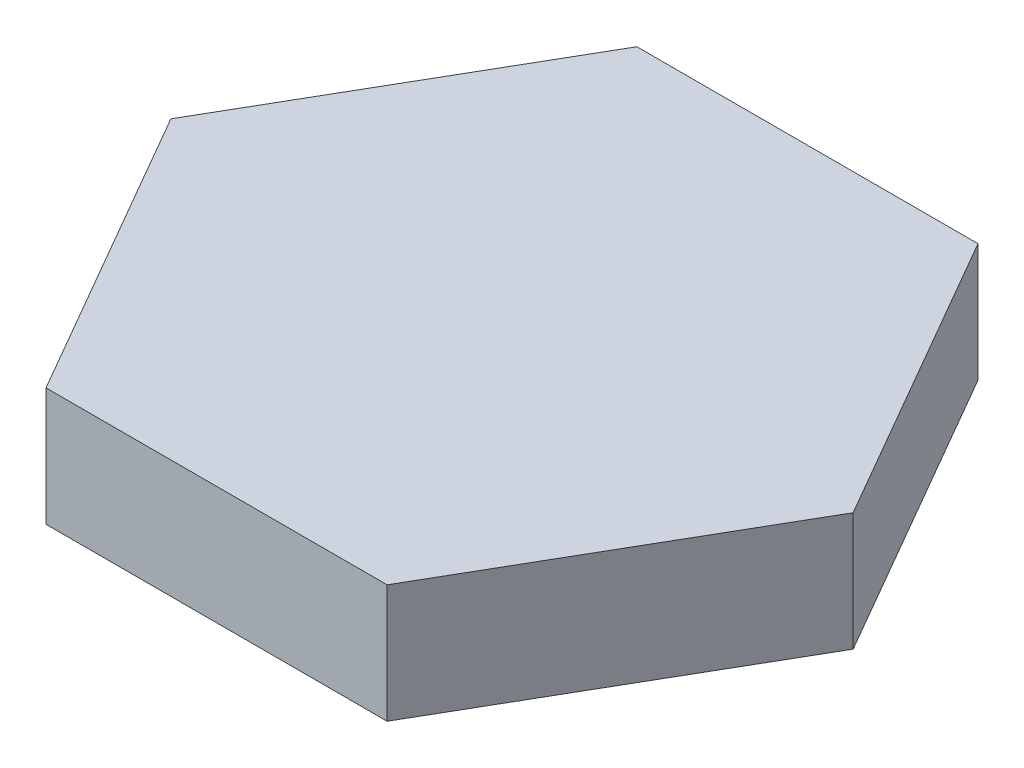
ISO-10303-21;
HEADER;
FILE_DESCRIPTION(('STEP AP214'),'2;1');
FILE_NAME('part.step','',(''),(''),'','','');
FILE_SCHEMA(('AUTOMOTIVE_DESIGN { 1 0 10303 214 1 1 1 1 }'));
ENDSEC;
DATA;
#1=APPLICATION_CONTEXT('core data for automotive mechanical design processes');
#2=APPLICATION_PROTOCOL_DEFINITION('international standard','automotive_design',2000,#1);
#3=PRODUCT_CONTEXT('',#1,'mechanical');
#4=PRODUCT('Part','Part','',(#3));
#5=PRODUCT_RELATED_PRODUCT_CATEGORY('part','',(#4));
#6=PRODUCT_DEFINITION_FORMATION('','',#4);
#7=PRODUCT_DEFINITION_CONTEXT('part definition',#1,'design');
#8=PRODUCT_DEFINITION('design','',#6,#7);
#9=PRODUCT_DEFINITION_SHAPE('','',#8);
#10=(LENGTH_UNIT() NAMED_UNIT(*) SI_UNIT(.MILLI.,.METRE.));
#11=(NAMED_UNIT(*) PLANE_ANGLE_UNIT() SI_UNIT($,.RADIAN.));
#12=(NAMED_UNIT(*) SI_UNIT($,.STERADIAN.) SOLID_ANGLE_UNIT());
#13=UNCERTAINTY_MEASURE_WITH_UNIT(LENGTH_MEASURE(1.E-05),#10,'distance_accuracy_value','');
#14=(GEOMETRIC_REPRESENTATION_CONTEXT(3) GLOBAL_UNCERTAINTY_ASSIGNED_CONTEXT((#13)) GLOBAL_UNIT_ASSIGNED_CONTEXT((#10,
#11,#12)) REPRESENTATION_CONTEXT('',''));
#15=CARTESIAN_POINT('',(0.,0.,0.));
#16=DIRECTION('',(0.,0.,1.));
#17=DIRECTION('',(1.,0.,0.));
#18=AXIS2_PLACEMENT_3D('',#15,#16,#17);
#19=CARTESIAN_POINT('',(14.4337567297407,10.,-25.));
#20=DIRECTION('',(0.,0.,1.));
#21=DIRECTION('',(1.,0.,0.));
#22=AXIS2_PLACEMENT_3D('',#19,#20,#21);
#23=PLANE('',#22);
#24=DIRECTION('',(-1.,0.,0.));
#25=VECTOR('',#24,1.);
#26=CARTESIAN_POINT('',(14.4337567297407,0.,-25.));
#27=LINE('',#26,#25);
#28=CARTESIAN_POINT('',(14.4337567297407,0.,-25.));
#29=VERTEX_POINT('',#28);
#30=CARTESIAN_POINT('',(-14.4337567297406,0.,-25.));
#31=VERTEX_POINT('',#30);
#32=EDGE_CURVE('E125',#29,#31,#27,.T.);
#33=ORIENTED_EDGE('',*,*,#32,.T.);
#34=DIRECTION('',(0.,-1.,0.));
#35=VECTOR('',#34,1.);
#36=CARTESIAN_POINT('',(-14.4337567297406,10.,-25.));
#37=LINE('',#36,#35);
#38=CARTESIAN_POINT('',(-14.4337567297406,10.,-25.));
#39=VERTEX_POINT('',#38);
#40=EDGE_CURVE('E11',#39,#31,#37,.T.);
#41=ORIENTED_EDGE('',*,*,#40,.F.);
#42=DIRECTION('',(-1.,0.,0.));
#43=VECTOR('',#42,1.);
#44=CARTESIAN_POINT('',(14.4337567297407,10.,-25.));
#45=LINE('',#44,#43);
#46=CARTESIAN_POINT('',(14.4337567297407,10.,-25.));
#47=VERTEX_POINT('',#46);
#48=EDGE_CURVE('E135',#47,#39,#45,.T.);
#49=ORIENTED_EDGE('',*,*,#48,.F.);
#50=DIRECTION('',(0.,-1.,0.));
#51=VECTOR('',#50,1.);
#52=CARTESIAN_POINT('',(14.4337567297407,10.,-25.));
#53=LINE('',#52,#51);
#54=EDGE_CURVE('E121',#47,#29,#53,.T.);
#55=ORIENTED_EDGE('',*,*,#54,.T.);
#56=EDGE_LOOP('',(#33,#41,#49,#55));
#57=FACE_BOUND('',#56,.T.);
#58=ADVANCED_FACE('F41',(#57),#23,.F.);
#59=CARTESIAN_POINT('',(-14.4337567297406,10.,-25.));
#60=DIRECTION('',(0.866025403784438,0.,0.500000000000001));
#61=DIRECTION('',(0.500000000000001,0.,-0.866025403784438));
#62=AXIS2_PLACEMENT_3D('',#59,#60,#61);
#63=PLANE('',#62);
#64=DIRECTION('',(-0.500000000000001,0.,0.866025403784438));
#65=VECTOR('',#64,1.);
#66=CARTESIAN_POINT('',(-14.4337567297406,0.,-25.));
#67=LINE('',#66,#65);
#68=CARTESIAN_POINT('',(-28.8675134594813,0.,0.));
#69=VERTEX_POINT('',#68);
#70=EDGE_CURVE('E128',#31,#69,#67,.T.);
#71=ORIENTED_EDGE('',*,*,#70,.T.);
#72=DIRECTION('',(0.,-1.,0.));
#73=VECTOR('',#72,1.);
#74=CARTESIAN_POINT('',(-28.8675134594813,10.,0.));
#75=LINE('',#74,#73);
#76=CARTESIAN_POINT('',(-28.8675134594813,10.,0.));
#77=VERTEX_POINT('',#76);
#78=EDGE_CURVE('E49',#77,#69,#75,.T.);
#79=ORIENTED_EDGE('',*,*,#78,.F.);
#80=DIRECTION('',(-0.500000000000001,0.,0.866025403784438));
#81=VECTOR('',#80,1.);
#82=CARTESIAN_POINT('',(-14.4337567297406,10.,-25.));
#83=LINE('',#82,#81);
#84=EDGE_CURVE('E94',#39,#77,#83,.T.);
#85=ORIENTED_EDGE('',*,*,#84,.F.);
#86=ORIENTED_EDGE('',*,*,#40,.T.);
#87=EDGE_LOOP('',(#71,#79,#85,#86));
#88=FACE_BOUND('',#87,.T.);
#89=ADVANCED_FACE('F159',(#88),#63,.F.);
#90=CARTESIAN_POINT('',(-28.8675134594813,10.,0.));
#91=DIRECTION('',(0.866025403784438,0.,-0.5));
#92=DIRECTION('',(-0.5,0.,-0.866025403784439));
#93=AXIS2_PLACEMENT_3D('',#90,#91,#92);
#94=PLANE('',#93);
#95=DIRECTION('',(0.5,0.,0.866025403784438));
#96=VECTOR('',#95,1.);
#97=CARTESIAN_POINT('',(-28.8675134594813,0.,0.));
#98=LINE('',#97,#96);
#99=CARTESIAN_POINT('',(-14.4337567297406,0.,25.));
#100=VERTEX_POINT('',#99);
#101=EDGE_CURVE('E130',#69,#100,#98,.T.);
#102=ORIENTED_EDGE('',*,*,#101,.T.);
#103=DIRECTION('',(0.,-1.,0.));
#104=VECTOR('',#103,1.);
#105=CARTESIAN_POINT('',(-14.4337567297406,10.,25.));
#106=LINE('',#105,#104);
#107=CARTESIAN_POINT('',(-14.4337567297406,10.,25.));
#108=VERTEX_POINT('',#107);
#109=EDGE_CURVE('E116',#108,#100,#106,.T.);
#110=ORIENTED_EDGE('',*,*,#109,.F.);
#111=DIRECTION('',(0.5,0.,0.866025403784438));
#112=VECTOR('',#111,1.);
#113=CARTESIAN_POINT('',(-28.8675134594813,10.,0.));
#114=LINE('',#113,#112);
#115=EDGE_CURVE('E107',#77,#108,#114,.T.);
#116=ORIENTED_EDGE('',*,*,#115,.F.);
#117=ORIENTED_EDGE('',*,*,#78,.T.);
#118=EDGE_LOOP('',(#102,#110,#116,#117));
#119=FACE_BOUND('',#118,.T.);
#120=ADVANCED_FACE('F141',(#119),#94,.F.);
#121=CARTESIAN_POINT('',(-14.4337567297406,10.,25.));
#122=DIRECTION('',(0.,0.,-1.));
#123=DIRECTION('',(-1.,0.,0.));
#124=AXIS2_PLACEMENT_3D('',#121,#122,#123);
#125=PLANE('',#124);
#126=DIRECTION('',(1.,0.,0.));
#127=VECTOR('',#126,1.);
#128=CARTESIAN_POINT('',(-14.4337567297406,0.,25.));
#129=LINE('',#128,#127);
#130=CARTESIAN_POINT('',(14.4337567297407,0.,25.));
#131=VERTEX_POINT('',#130);
#132=EDGE_CURVE('E115',#100,#131,#129,.T.);
#133=ORIENTED_EDGE('',*,*,#132,.T.);
#134=DIRECTION('',(0.,-1.,0.));
#135=VECTOR('',#134,1.);
#136=CARTESIAN_POINT('',(14.4337567297407,10.,25.));
#137=LINE('',#136,#135);
#138=CARTESIAN_POINT('',(14.4337567297407,10.,25.));
#139=VERTEX_POINT('',#138);
#140=EDGE_CURVE('E112',#139,#131,#137,.T.);
#141=ORIENTED_EDGE('',*,*,#140,.F.);
#142=DIRECTION('',(1.,0.,0.));
#143=VECTOR('',#142,1.);
#144=CARTESIAN_POINT('',(-14.4337567297406,10.,25.));
#145=LINE('',#144,#143);
#146=EDGE_CURVE('E101',#108,#139,#145,.T.);
#147=ORIENTED_EDGE('',*,*,#146,.F.);
#148=ORIENTED_EDGE('',*,*,#109,.T.);
#149=EDGE_LOOP('',(#133,#141,#147,#148));
#150=FACE_BOUND('',#149,.T.);
#151=ADVANCED_FACE('F113',(#150),#125,.F.);
#152=CARTESIAN_POINT('',(14.4337567297407,10.,25.));
#153=DIRECTION('',(-0.866025403784438,0.,-0.5));
#154=DIRECTION('',(-0.5,0.,0.866025403784438));
#155=AXIS2_PLACEMENT_3D('',#152,#153,#154);
#156=PLANE('',#155);
#157=DIRECTION('',(0.5,0.,-0.866025403784438));
#158=VECTOR('',#157,1.);
#159=CARTESIAN_POINT('',(14.4337567297407,0.,25.));
#160=LINE('',#159,#158);
#161=CARTESIAN_POINT('',(28.8675134594813,0.,0.));
#162=VERTEX_POINT('',#161);
#163=EDGE_CURVE('E80',#131,#162,#160,.T.);
#164=ORIENTED_EDGE('',*,*,#163,.T.);
#165=DIRECTION('',(0.,-1.,0.));
#166=VECTOR('',#165,1.);
#167=CARTESIAN_POINT('',(28.8675134594813,10.,0.));
#168=LINE('',#167,#166);
#169=CARTESIAN_POINT('',(28.8675134594813,10.,0.));
#170=VERTEX_POINT('',#169);
#171=EDGE_CURVE('E117',#170,#162,#168,.T.);
#172=ORIENTED_EDGE('',*,*,#171,.F.);
#173=DIRECTION('',(0.5,0.,-0.866025403784438));
#174=VECTOR('',#173,1.);
#175=CARTESIAN_POINT('',(14.4337567297407,10.,25.));
#176=LINE('',#175,#174);
#177=EDGE_CURVE('E105',#139,#170,#176,.T.);
#178=ORIENTED_EDGE('',*,*,#177,.F.);
#179=ORIENTED_EDGE('',*,*,#140,.T.);
#180=EDGE_LOOP('',(#164,#172,#178,#179));
#181=FACE_BOUND('',#180,.T.);
#182=ADVANCED_FACE('F119',(#181),#156,.F.);
#183=CARTESIAN_POINT('',(28.8675134594813,10.,0.));
#184=DIRECTION('',(-0.866025403784439,0.,0.5));
#185=DIRECTION('',(0.5,0.,0.866025403784439));
#186=AXIS2_PLACEMENT_3D('',#183,#184,#185);
#187=PLANE('',#186);
#188=DIRECTION('',(-0.5,0.,-0.866025403784439));
#189=VECTOR('',#188,1.);
#190=CARTESIAN_POINT('',(28.8675134594813,0.,0.));
#191=LINE('',#190,#189);
#192=EDGE_CURVE('E86',#162,#29,#191,.T.);
#193=ORIENTED_EDGE('',*,*,#192,.T.);
#194=ORIENTED_EDGE('',*,*,#54,.F.);
#195=DIRECTION('',(-0.5,0.,-0.866025403784439));
#196=VECTOR('',#195,1.);
#197=CARTESIAN_POINT('',(28.8675134594813,10.,0.));
#198=LINE('',#197,#196);
#199=EDGE_CURVE('E57',#170,#47,#198,.T.);
#200=ORIENTED_EDGE('',*,*,#199,.F.);
#201=ORIENTED_EDGE('',*,*,#171,.T.);
#202=EDGE_LOOP('',(#193,#194,#200,#201));
#203=FACE_BOUND('',#202,.T.);
#204=ADVANCED_FACE('F148',(#203),#187,.F.);
#205=CARTESIAN_POINT('',(0.,10.,0.));
#206=DIRECTION('',(0.,1.,0.));
#207=DIRECTION('',(0.,0.,1.));
#208=AXIS2_PLACEMENT_3D('',#205,#206,#207);
#209=PLANE('',#208);
#210=ORIENTED_EDGE('',*,*,#48,.T.);
#211=ORIENTED_EDGE('',*,*,#84,.T.);
#212=ORIENTED_EDGE('',*,*,#115,.T.);
#213=ORIENTED_EDGE('',*,*,#146,.T.);
#214=ORIENTED_EDGE('',*,*,#177,.T.);
#215=ORIENTED_EDGE('',*,*,#199,.T.);
#216=EDGE_LOOP('',(#210,#211,#212,#213,#214,#215));
#217=FACE_BOUND('',#216,.T.);
#218=ADVANCED_FACE('F103',(#217),#209,.T.);
#219=CARTESIAN_POINT('',(0.,0.,0.));
#220=DIRECTION('',(0.,1.,0.));
#221=DIRECTION('',(0.,0.,1.));
#222=AXIS2_PLACEMENT_3D('',#219,#220,#221);
#223=PLANE('',#222);
#224=ORIENTED_EDGE('',*,*,#32,.F.);
#225=ORIENTED_EDGE('',*,*,#192,.F.);
#226=ORIENTED_EDGE('',*,*,#163,.F.);
#227=ORIENTED_EDGE('',*,*,#132,.F.);
#228=ORIENTED_EDGE('',*,*,#101,.F.);
#229=ORIENTED_EDGE('',*,*,#70,.F.);
#230=EDGE_LOOP('',(#224,#225,#226,#227,#228,#229));
#231=FACE_BOUND('',#230,.T.);
#232=ADVANCED_FACE('F144',(#231),#223,.F.);
#233=CLOSED_SHELL('',(#58,#89,#120,#151,#182,#204,#218,#232));
#234=MANIFOLD_SOLID_BREP('B2',#233);
#235=ADVANCED_BREP_SHAPE_REPRESENTATION('',(#18,#234),#14);
#236=SHAPE_DEFINITION_REPRESENTATION(#9,#235);
ENDSEC;
END-ISO-10303-21;
